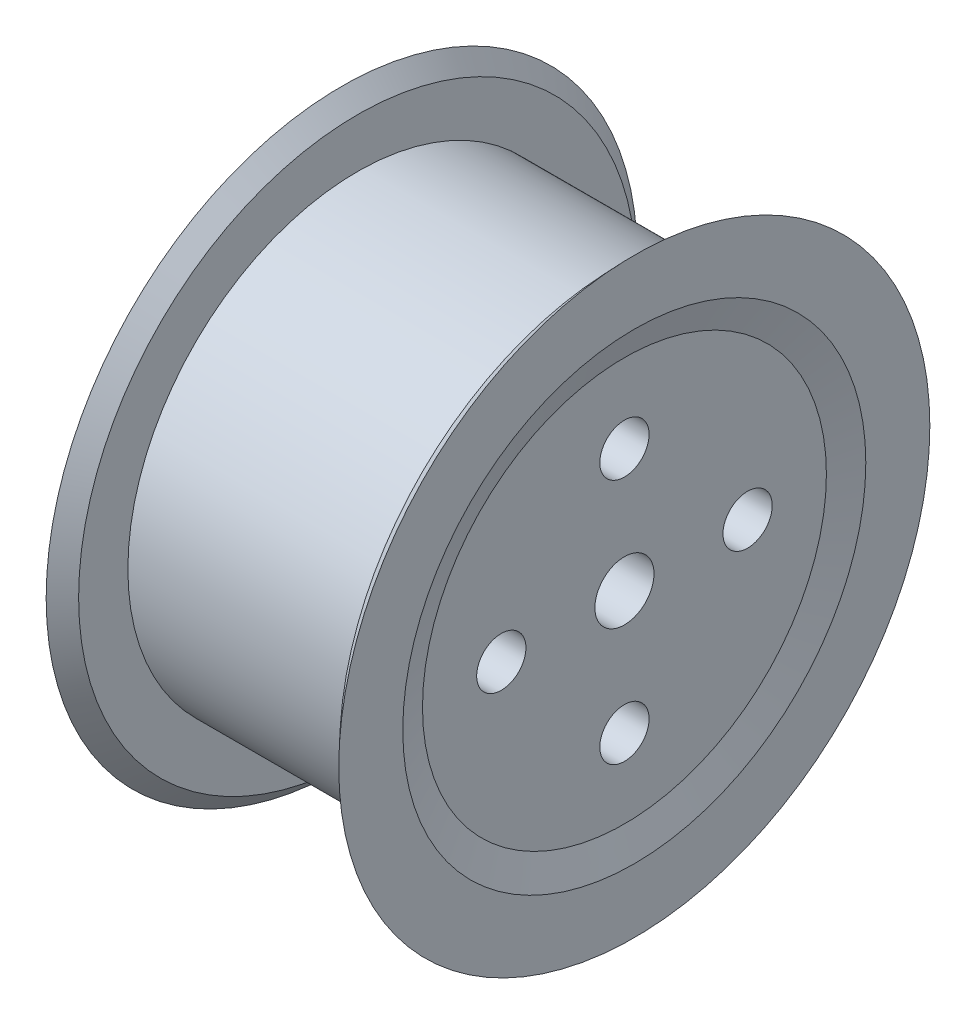
ISO-10303-21;
HEADER;
FILE_DESCRIPTION(('STEP AP214'),'2;1');
FILE_NAME('part.step','',(''),(''),'','','');
FILE_SCHEMA(('AUTOMOTIVE_DESIGN { 1 0 10303 214 1 1 1 1 }'));
ENDSEC;
DATA;
#1=APPLICATION_CONTEXT('core data for automotive mechanical design processes');
#2=APPLICATION_PROTOCOL_DEFINITION('international standard','automotive_design',2000,#1);
#3=PRODUCT_CONTEXT('',#1,'mechanical');
#4=PRODUCT('Part','Part','',(#3));
#5=PRODUCT_RELATED_PRODUCT_CATEGORY('part','',(#4));
#6=PRODUCT_DEFINITION_FORMATION('','',#4);
#7=PRODUCT_DEFINITION_CONTEXT('part definition',#1,'design');
#8=PRODUCT_DEFINITION('design','',#6,#7);
#9=PRODUCT_DEFINITION_SHAPE('','',#8);
#10=(LENGTH_UNIT() NAMED_UNIT(*) SI_UNIT(.MILLI.,.METRE.));
#11=(NAMED_UNIT(*) PLANE_ANGLE_UNIT() SI_UNIT($,.RADIAN.));
#12=(NAMED_UNIT(*) SI_UNIT($,.STERADIAN.) SOLID_ANGLE_UNIT());
#13=UNCERTAINTY_MEASURE_WITH_UNIT(LENGTH_MEASURE(1.E-05),#10,'distance_accuracy_value','');
#14=(GEOMETRIC_REPRESENTATION_CONTEXT(3) GLOBAL_UNCERTAINTY_ASSIGNED_CONTEXT((#13)) GLOBAL_UNIT_ASSIGNED_CONTEXT((#10,
#11,#12)) REPRESENTATION_CONTEXT('',''));
#15=CARTESIAN_POINT('',(0.,0.,0.));
#16=DIRECTION('',(0.,0.,1.));
#17=DIRECTION('',(1.,0.,0.));
#18=AXIS2_PLACEMENT_3D('',#15,#16,#17);
#19=CARTESIAN_POINT('',(1.,0.,0.));
#20=DIRECTION('',(1.,0.,0.));
#21=DIRECTION('',(0.,0.,-1.));
#22=AXIS2_PLACEMENT_3D('',#19,#20,#21);
#23=PLANE('',#22);
#24=CARTESIAN_POINT('',(1.,0.,0.));
#25=DIRECTION('',(-1.,0.,0.));
#26=DIRECTION('',(0.,0.,1.));
#27=AXIS2_PLACEMENT_3D('',#24,#25,#26);
#28=CIRCLE('',#27,17.45);
#29=CARTESIAN_POINT('',(1.,0.,17.45));
#30=VERTEX_POINT('',#29);
#31=EDGE_CURVE('E10',#30,#30,#28,.T.);
#32=ORIENTED_EDGE('',*,*,#31,.F.);
#33=EDGE_LOOP('',(#32));
#34=FACE_BOUND('',#33,.T.);
#35=CARTESIAN_POINT('',(1.,0.,0.));
#36=DIRECTION('',(-1.,0.,0.));
#37=DIRECTION('',(0.,0.,1.));
#38=AXIS2_PLACEMENT_3D('',#35,#36,#37);
#39=CIRCLE('',#38,20.5);
#40=CARTESIAN_POINT('',(1.,0.,20.5));
#41=VERTEX_POINT('',#40);
#42=EDGE_CURVE('E76',#41,#41,#39,.T.);
#43=ORIENTED_EDGE('',*,*,#42,.T.);
#44=EDGE_LOOP('',(#43));
#45=FACE_BOUND('',#44,.T.);
#46=ADVANCED_FACE('F41',(#34,#45),#23,.F.);
#47=CARTESIAN_POINT('',(0.,0.,0.));
#48=DIRECTION('',(-1.,0.,0.));
#49=DIRECTION('',(0.,0.,1.));
#50=AXIS2_PLACEMENT_3D('',#47,#48,#49);
#51=CYLINDRICAL_SURFACE('',#50,17.45);
#52=CARTESIAN_POINT('',(-7.79999999999999,0.,0.));
#53=DIRECTION('',(-1.,0.,0.));
#54=DIRECTION('',(0.,0.,1.));
#55=AXIS2_PLACEMENT_3D('',#52,#53,#54);
#56=CIRCLE('',#55,17.45);
#57=CARTESIAN_POINT('',(-7.79999999999999,0.,17.45));
#58=VERTEX_POINT('',#57);
#59=EDGE_CURVE('E49',#58,#58,#56,.T.);
#60=ORIENTED_EDGE('',*,*,#59,.F.);
#61=EDGE_LOOP('',(#60));
#62=FACE_BOUND('',#61,.T.);
#63=ORIENTED_EDGE('',*,*,#31,.T.);
#64=EDGE_LOOP('',(#63));
#65=FACE_BOUND('',#64,.T.);
#66=ADVANCED_FACE('F139',(#62,#65),#51,.T.);
#67=CARTESIAN_POINT('',(-7.8,0.,0.));
#68=DIRECTION('',(1.,0.,0.));
#69=DIRECTION('',(0.,0.,-1.));
#70=AXIS2_PLACEMENT_3D('',#67,#68,#69);
#71=PLANE('',#70);
#72=CARTESIAN_POINT('',(-7.79999999999999,0.,0.));
#73=DIRECTION('',(1.,0.,0.));
#74=DIRECTION('',(0.,0.,-1.));
#75=AXIS2_PLACEMENT_3D('',#72,#73,#74);
#76=CIRCLE('',#75,3.);
#77=CARTESIAN_POINT('',(-7.79999999999999,0.,-3.));
#78=VERTEX_POINT('',#77);
#79=EDGE_CURVE('E437',#78,#78,#76,.T.);
#80=ORIENTED_EDGE('',*,*,#79,.T.);
#81=EDGE_LOOP('',(#80));
#82=FACE_BOUND('',#81,.T.);
#83=CARTESIAN_POINT('',(-7.8,0.,-12.5));
#84=DIRECTION('',(-1.,0.,0.));
#85=DIRECTION('',(0.,0.,1.));
#86=AXIS2_PLACEMENT_3D('',#83,#84,#85);
#87=CIRCLE('',#86,3.025);
#88=CARTESIAN_POINT('',(-7.8,0.,-9.475));
#89=VERTEX_POINT('',#88);
#90=EDGE_CURVE('E444',#89,#89,#87,.T.);
#91=ORIENTED_EDGE('',*,*,#90,.F.);
#92=EDGE_LOOP('',(#91));
#93=FACE_BOUND('',#92,.T.);
#94=CARTESIAN_POINT('',(-7.8,12.5,0.));
#95=DIRECTION('',(-1.,0.,0.));
#96=DIRECTION('',(0.,0.,1.));
#97=AXIS2_PLACEMENT_3D('',#94,#95,#96);
#98=CIRCLE('',#97,3.025);
#99=CARTESIAN_POINT('',(-7.8,12.5,3.025));
#100=VERTEX_POINT('',#99);
#101=EDGE_CURVE('E454',#100,#100,#98,.T.);
#102=ORIENTED_EDGE('',*,*,#101,.F.);
#103=EDGE_LOOP('',(#102));
#104=FACE_BOUND('',#103,.T.);
#105=CARTESIAN_POINT('',(-7.8,0.,12.5));
#106=DIRECTION('',(-1.,0.,0.));
#107=DIRECTION('',(0.,0.,1.));
#108=AXIS2_PLACEMENT_3D('',#105,#106,#107);
#109=CIRCLE('',#108,3.025);
#110=CARTESIAN_POINT('',(-7.8,0.,15.525));
#111=VERTEX_POINT('',#110);
#112=EDGE_CURVE('E462',#111,#111,#109,.T.);
#113=ORIENTED_EDGE('',*,*,#112,.F.);
#114=EDGE_LOOP('',(#113));
#115=FACE_BOUND('',#114,.T.);
#116=CARTESIAN_POINT('',(-7.8,-12.5,0.));
#117=DIRECTION('',(-1.,0.,0.));
#118=DIRECTION('',(0.,0.,1.));
#119=AXIS2_PLACEMENT_3D('',#116,#117,#118);
#120=CIRCLE('',#119,3.025);
#121=CARTESIAN_POINT('',(-7.8,-12.5,3.025));
#122=VERTEX_POINT('',#121);
#123=EDGE_CURVE('E469',#122,#122,#120,.T.);
#124=ORIENTED_EDGE('',*,*,#123,.F.);
#125=EDGE_LOOP('',(#124));
#126=FACE_BOUND('',#125,.T.);
#127=ORIENTED_EDGE('',*,*,#59,.T.);
#128=EDGE_LOOP('',(#127));
#129=FACE_BOUND('',#128,.T.);
#130=ADVANCED_FACE('F130',(#82,#93,#104,#115,#126,#129),#71,.F.);
#131=CARTESIAN_POINT('',(28.7,0.,0.));
#132=DIRECTION('',(1.,0.,0.));
#133=DIRECTION('',(0.,0.,-1.));
#134=AXIS2_PLACEMENT_3D('',#131,#132,#133);
#135=PLANE('',#134);
#136=CARTESIAN_POINT('',(28.7,0.,0.));
#137=DIRECTION('',(1.,0.,0.));
#138=DIRECTION('',(0.,0.,-1.));
#139=AXIS2_PLACEMENT_3D('',#136,#137,#138);
#140=CIRCLE('',#139,3.);
#141=CARTESIAN_POINT('',(28.7,0.,-3.));
#142=VERTEX_POINT('',#141);
#143=EDGE_CURVE('E439',#142,#142,#140,.T.);
#144=ORIENTED_EDGE('',*,*,#143,.F.);
#145=EDGE_LOOP('',(#144));
#146=FACE_BOUND('',#145,.T.);
#147=CARTESIAN_POINT('',(28.7,0.,-12.5));
#148=DIRECTION('',(1.,0.,0.));
#149=DIRECTION('',(0.,0.,-1.));
#150=AXIS2_PLACEMENT_3D('',#147,#148,#149);
#151=CIRCLE('',#150,2.5);
#152=CARTESIAN_POINT('',(28.7,0.,-15.));
#153=VERTEX_POINT('',#152);
#154=EDGE_CURVE('E44',#153,#153,#151,.T.);
#155=ORIENTED_EDGE('',*,*,#154,.F.);
#156=EDGE_LOOP('',(#155));
#157=FACE_BOUND('',#156,.T.);
#158=CARTESIAN_POINT('',(28.7,-12.5,0.));
#159=DIRECTION('',(1.,0.,0.));
#160=DIRECTION('',(0.,0.,-1.));
#161=AXIS2_PLACEMENT_3D('',#158,#159,#160);
#162=CIRCLE('',#161,2.5);
#163=CARTESIAN_POINT('',(28.7,-12.5,-2.5));
#164=VERTEX_POINT('',#163);
#165=EDGE_CURVE('E68',#164,#164,#162,.T.);
#166=ORIENTED_EDGE('',*,*,#165,.F.);
#167=EDGE_LOOP('',(#166));
#168=FACE_BOUND('',#167,.T.);
#169=CARTESIAN_POINT('',(28.7,0.,12.5));
#170=DIRECTION('',(1.,0.,0.));
#171=DIRECTION('',(0.,0.,-1.));
#172=AXIS2_PLACEMENT_3D('',#169,#170,#171);
#173=CIRCLE('',#172,2.5);
#174=CARTESIAN_POINT('',(28.7,0.,10.));
#175=VERTEX_POINT('',#174);
#176=EDGE_CURVE('E64',#175,#175,#173,.T.);
#177=ORIENTED_EDGE('',*,*,#176,.F.);
#178=EDGE_LOOP('',(#177));
#179=FACE_BOUND('',#178,.T.);
#180=CARTESIAN_POINT('',(28.7,12.5,0.));
#181=DIRECTION('',(1.,0.,0.));
#182=DIRECTION('',(0.,0.,-1.));
#183=AXIS2_PLACEMENT_3D('',#180,#181,#182);
#184=CIRCLE('',#183,2.5);
#185=CARTESIAN_POINT('',(28.7,12.5,-2.5));
#186=VERTEX_POINT('',#185);
#187=EDGE_CURVE('E60',#186,#186,#184,.T.);
#188=ORIENTED_EDGE('',*,*,#187,.F.);
#189=EDGE_LOOP('',(#188));
#190=FACE_BOUND('',#189,.T.);
#191=CARTESIAN_POINT('',(28.7,0.,0.));
#192=DIRECTION('',(-1.,0.,0.));
#193=DIRECTION('',(0.,0.,1.));
#194=AXIS2_PLACEMENT_3D('',#191,#192,#193);
#195=CIRCLE('',#194,20.5);
#196=CARTESIAN_POINT('',(28.7,0.,20.5));
#197=VERTEX_POINT('',#196);
#198=EDGE_CURVE('E56',#197,#197,#195,.T.);
#199=ORIENTED_EDGE('',*,*,#198,.F.);
#200=EDGE_LOOP('',(#199));
#201=FACE_BOUND('',#200,.T.);
#202=ADVANCED_FACE('F128',(#146,#157,#168,#179,#190,#201),#135,.T.);
#203=CARTESIAN_POINT('',(29.7,0.,0.));
#204=DIRECTION('',(1.,0.,0.));
#205=DIRECTION('',(0.,0.,-1.));
#206=AXIS2_PLACEMENT_3D('',#203,#204,#205);
#207=CONICAL_SURFACE('',#206,23.5,1.24904577239825);
#208=ORIENTED_EDGE('',*,*,#198,.T.);
#209=EDGE_LOOP('',(#208));
#210=FACE_BOUND('',#209,.T.);
#211=CARTESIAN_POINT('',(29.7,0.,0.));
#212=DIRECTION('',(-1.,0.,0.));
#213=DIRECTION('',(0.,0.,1.));
#214=AXIS2_PLACEMENT_3D('',#211,#212,#213);
#215=CIRCLE('',#214,23.5);
#216=CARTESIAN_POINT('',(29.7,0.,23.5));
#217=VERTEX_POINT('',#216);
#218=EDGE_CURVE('E117',#217,#217,#215,.T.);
#219=ORIENTED_EDGE('',*,*,#218,.F.);
#220=EDGE_LOOP('',(#219));
#221=FACE_BOUND('',#220,.T.);
#222=ADVANCED_FACE('F125',(#210,#221),#207,.F.);
#223=CARTESIAN_POINT('',(29.7,0.,0.));
#224=DIRECTION('',(1.,0.,0.));
#225=DIRECTION('',(0.,0.,-1.));
#226=AXIS2_PLACEMENT_3D('',#223,#224,#225);
#227=PLANE('',#226);
#228=ORIENTED_EDGE('',*,*,#218,.T.);
#229=EDGE_LOOP('',(#228));
#230=FACE_BOUND('',#229,.T.);
#231=CARTESIAN_POINT('',(29.7,0.,0.));
#232=DIRECTION('',(-1.,0.,0.));
#233=DIRECTION('',(0.,0.,1.));
#234=AXIS2_PLACEMENT_3D('',#231,#232,#233);
#235=CIRCLE('',#234,30.);
#236=CARTESIAN_POINT('',(29.7,0.,30.));
#237=VERTEX_POINT('',#236);
#238=EDGE_CURVE('E113',#237,#237,#235,.T.);
#239=ORIENTED_EDGE('',*,*,#238,.F.);
#240=EDGE_LOOP('',(#239));
#241=FACE_BOUND('',#240,.T.);
#242=ADVANCED_FACE('F137',(#230,#241),#227,.T.);
#243=CARTESIAN_POINT('',(28.1,0.,0.));
#244=DIRECTION('',(1.,0.,0.));
#245=DIRECTION('',(0.,0.,-1.));
#246=AXIS2_PLACEMENT_3D('',#243,#244,#245);
#247=CONICAL_SURFACE('',#246,28.305,0.814221741521467);
#248=ORIENTED_EDGE('',*,*,#238,.T.);
#249=EDGE_LOOP('',(#248));
#250=FACE_BOUND('',#249,.T.);
#251=CARTESIAN_POINT('',(28.1,0.,0.));
#252=DIRECTION('',(-1.,0.,0.));
#253=DIRECTION('',(0.,0.,1.));
#254=AXIS2_PLACEMENT_3D('',#251,#252,#253);
#255=CIRCLE('',#254,28.305);
#256=CARTESIAN_POINT('',(28.1,0.,28.305));
#257=VERTEX_POINT('',#256);
#258=EDGE_CURVE('E109',#257,#257,#255,.T.);
#259=ORIENTED_EDGE('',*,*,#258,.F.);
#260=EDGE_LOOP('',(#259));
#261=FACE_BOUND('',#260,.T.);
#262=ADVANCED_FACE('F179',(#250,#261),#247,.T.);
#263=CARTESIAN_POINT('',(28.1,0.,0.));
#264=DIRECTION('',(-1.,0.,0.));
#265=DIRECTION('',(0.,0.,1.));
#266=AXIS2_PLACEMENT_3D('',#263,#264,#265);
#267=PLANE('',#266);
#268=ORIENTED_EDGE('',*,*,#258,.T.);
#269=EDGE_LOOP('',(#268));
#270=FACE_BOUND('',#269,.T.);
#271=CARTESIAN_POINT('',(28.1,0.,0.));
#272=DIRECTION('',(-1.,0.,0.));
#273=DIRECTION('',(0.,0.,1.));
#274=AXIS2_PLACEMENT_3D('',#271,#272,#273);
#275=CIRCLE('',#274,23.305);
#276=CARTESIAN_POINT('',(28.1,0.,23.305));
#277=VERTEX_POINT('',#276);
#278=EDGE_CURVE('E105',#277,#277,#275,.T.);
#279=ORIENTED_EDGE('',*,*,#278,.F.);
#280=EDGE_LOOP('',(#279));
#281=FACE_BOUND('',#280,.T.);
#282=ADVANCED_FACE('F189',(#270,#281),#267,.T.);
#283=CARTESIAN_POINT('',(0.,0.,0.));
#284=DIRECTION('',(-1.,0.,0.));
#285=DIRECTION('',(0.,0.,1.));
#286=AXIS2_PLACEMENT_3D('',#283,#284,#285);
#287=CYLINDRICAL_SURFACE('',#286,23.305);
#288=ORIENTED_EDGE('',*,*,#278,.T.);
#289=EDGE_LOOP('',(#288));
#290=FACE_BOUND('',#289,.T.);
#291=CARTESIAN_POINT('',(1.6,0.,0.));
#292=DIRECTION('',(-1.,0.,0.));
#293=DIRECTION('',(0.,0.,1.));
#294=AXIS2_PLACEMENT_3D('',#291,#292,#293);
#295=CIRCLE('',#294,23.305);
#296=CARTESIAN_POINT('',(1.6,0.,23.305));
#297=VERTEX_POINT('',#296);
#298=EDGE_CURVE('E101',#297,#297,#295,.T.);
#299=ORIENTED_EDGE('',*,*,#298,.F.);
#300=EDGE_LOOP('',(#299));
#301=FACE_BOUND('',#300,.T.);
#302=ADVANCED_FACE('F199',(#290,#301),#287,.T.);
#303=CARTESIAN_POINT('',(1.6,0.,0.));
#304=DIRECTION('',(1.,0.,0.));
#305=DIRECTION('',(0.,0.,-1.));
#306=AXIS2_PLACEMENT_3D('',#303,#304,#305);
#307=PLANE('',#306);
#308=ORIENTED_EDGE('',*,*,#298,.T.);
#309=EDGE_LOOP('',(#308));
#310=FACE_BOUND('',#309,.T.);
#311=CARTESIAN_POINT('',(1.6,0.,0.));
#312=DIRECTION('',(-1.,0.,0.));
#313=DIRECTION('',(0.,0.,1.));
#314=AXIS2_PLACEMENT_3D('',#311,#312,#313);
#315=CIRCLE('',#314,28.305);
#316=CARTESIAN_POINT('',(1.6,0.,28.305));
#317=VERTEX_POINT('',#316);
#318=EDGE_CURVE('E97',#317,#317,#315,.T.);
#319=ORIENTED_EDGE('',*,*,#318,.F.);
#320=EDGE_LOOP('',(#319));
#321=FACE_BOUND('',#320,.T.);
#322=ADVANCED_FACE('F209',(#310,#321),#307,.T.);
#323=CARTESIAN_POINT('',(0.,0.,0.));
#324=DIRECTION('',(-1.,0.,0.));
#325=DIRECTION('',(0.,0.,1.));
#326=AXIS2_PLACEMENT_3D('',#323,#324,#325);
#327=CONICAL_SURFACE('',#326,30.,0.814221741521466);
#328=ORIENTED_EDGE('',*,*,#318,.T.);
#329=EDGE_LOOP('',(#328));
#330=FACE_BOUND('',#329,.T.);
#331=CARTESIAN_POINT('',(0.,0.,0.));
#332=DIRECTION('',(-1.,0.,0.));
#333=DIRECTION('',(0.,0.,1.));
#334=AXIS2_PLACEMENT_3D('',#331,#332,#333);
#335=CIRCLE('',#334,30.);
#336=CARTESIAN_POINT('',(0.,0.,30.));
#337=VERTEX_POINT('',#336);
#338=EDGE_CURVE('E89',#337,#337,#335,.T.);
#339=ORIENTED_EDGE('',*,*,#338,.F.);
#340=EDGE_LOOP('',(#339));
#341=FACE_BOUND('',#340,.T.);
#342=ADVANCED_FACE('F219',(#330,#341),#327,.T.);
#343=CARTESIAN_POINT('',(0.,0.,0.));
#344=DIRECTION('',(-1.,0.,0.));
#345=DIRECTION('',(0.,0.,1.));
#346=AXIS2_PLACEMENT_3D('',#343,#344,#345);
#347=PLANE('',#346);
#348=ORIENTED_EDGE('',*,*,#338,.T.);
#349=EDGE_LOOP('',(#348));
#350=FACE_BOUND('',#349,.T.);
#351=CARTESIAN_POINT('',(0.,0.,0.));
#352=DIRECTION('',(-1.,0.,0.));
#353=DIRECTION('',(0.,0.,1.));
#354=AXIS2_PLACEMENT_3D('',#351,#352,#353);
#355=CIRCLE('',#354,23.5);
#356=CARTESIAN_POINT('',(0.,0.,23.5));
#357=VERTEX_POINT('',#356);
#358=EDGE_CURVE('E82',#357,#357,#355,.T.);
#359=ORIENTED_EDGE('',*,*,#358,.F.);
#360=EDGE_LOOP('',(#359));
#361=FACE_BOUND('',#360,.T.);
#362=ADVANCED_FACE('F229',(#350,#361),#347,.T.);
#363=CARTESIAN_POINT('',(0.,0.,0.));
#364=DIRECTION('',(-1.,0.,0.));
#365=DIRECTION('',(0.,0.,1.));
#366=AXIS2_PLACEMENT_3D('',#363,#364,#365);
#367=CONICAL_SURFACE('',#366,23.5,1.24904577239825);
#368=ORIENTED_EDGE('',*,*,#42,.F.);
#369=EDGE_LOOP('',(#368));
#370=FACE_BOUND('',#369,.T.);
#371=ORIENTED_EDGE('',*,*,#358,.T.);
#372=EDGE_LOOP('',(#371));
#373=FACE_BOUND('',#372,.T.);
#374=ADVANCED_FACE('F239',(#370,#373),#367,.F.);
#375=CARTESIAN_POINT('',(-7.79999999999999,12.5,0.));
#376=DIRECTION('',(1.,0.,0.));
#377=DIRECTION('',(0.,0.,-1.));
#378=AXIS2_PLACEMENT_3D('',#375,#376,#377);
#379=CYLINDRICAL_SURFACE('',#378,2.5);
#380=CARTESIAN_POINT('',(-7.275,12.5,0.));
#381=DIRECTION('',(-1.,0.,0.));
#382=DIRECTION('',(0.,0.,1.));
#383=AXIS2_PLACEMENT_3D('',#380,#381,#382);
#384=CIRCLE('',#383,2.49999999999999);
#385=CARTESIAN_POINT('',(-7.275,12.5,2.5));
#386=VERTEX_POINT('',#385);
#387=EDGE_CURVE('E458',#386,#386,#384,.T.);
#388=ORIENTED_EDGE('',*,*,#387,.T.);
#389=EDGE_LOOP('',(#388));
#390=FACE_BOUND('',#389,.T.);
#391=ORIENTED_EDGE('',*,*,#187,.T.);
#392=EDGE_LOOP('',(#391));
#393=FACE_BOUND('',#392,.T.);
#394=ADVANCED_FACE('F249',(#390,#393),#379,.F.);
#395=CARTESIAN_POINT('',(-7.79999999999999,0.,12.5));
#396=DIRECTION('',(1.,0.,0.));
#397=DIRECTION('',(0.,0.,-1.));
#398=AXIS2_PLACEMENT_3D('',#395,#396,#397);
#399=CYLINDRICAL_SURFACE('',#398,2.5);
#400=CARTESIAN_POINT('',(-7.275,0.,12.5));
#401=DIRECTION('',(-1.,0.,0.));
#402=DIRECTION('',(0.,0.,1.));
#403=AXIS2_PLACEMENT_3D('',#400,#401,#402);
#404=CIRCLE('',#403,2.49999999999999);
#405=CARTESIAN_POINT('',(-7.275,0.,15.));
#406=VERTEX_POINT('',#405);
#407=EDGE_CURVE('E466',#406,#406,#404,.T.);
#408=ORIENTED_EDGE('',*,*,#407,.T.);
#409=EDGE_LOOP('',(#408));
#410=FACE_BOUND('',#409,.T.);
#411=ORIENTED_EDGE('',*,*,#176,.T.);
#412=EDGE_LOOP('',(#411));
#413=FACE_BOUND('',#412,.T.);
#414=ADVANCED_FACE('F260',(#410,#413),#399,.F.);
#415=CARTESIAN_POINT('',(-7.79999999999999,-12.5,0.));
#416=DIRECTION('',(1.,0.,0.));
#417=DIRECTION('',(0.,0.,-1.));
#418=AXIS2_PLACEMENT_3D('',#415,#416,#417);
#419=CYLINDRICAL_SURFACE('',#418,2.5);
#420=CARTESIAN_POINT('',(-7.275,-12.5,0.));
#421=DIRECTION('',(-1.,0.,0.));
#422=DIRECTION('',(0.,0.,1.));
#423=AXIS2_PLACEMENT_3D('',#420,#421,#422);
#424=CIRCLE('',#423,2.49999999999999);
#425=CARTESIAN_POINT('',(-7.275,-12.5,2.49999999999999));
#426=VERTEX_POINT('',#425);
#427=EDGE_CURVE('E65',#426,#426,#424,.T.);
#428=ORIENTED_EDGE('',*,*,#427,.T.);
#429=EDGE_LOOP('',(#428));
#430=FACE_BOUND('',#429,.T.);
#431=ORIENTED_EDGE('',*,*,#165,.T.);
#432=EDGE_LOOP('',(#431));
#433=FACE_BOUND('',#432,.T.);
#434=ADVANCED_FACE('F270',(#430,#433),#419,.F.);
#435=CARTESIAN_POINT('',(-7.79999999999999,0.,-12.5));
#436=DIRECTION('',(1.,0.,0.));
#437=DIRECTION('',(0.,0.,-1.));
#438=AXIS2_PLACEMENT_3D('',#435,#436,#437);
#439=CYLINDRICAL_SURFACE('',#438,2.5);
#440=CARTESIAN_POINT('',(-7.275,0.,-12.5));
#441=DIRECTION('',(-1.,0.,0.));
#442=DIRECTION('',(0.,0.,1.));
#443=AXIS2_PLACEMENT_3D('',#440,#441,#442);
#444=CIRCLE('',#443,2.49999999999999);
#445=CARTESIAN_POINT('',(-7.275,0.,-10.));
#446=VERTEX_POINT('',#445);
#447=EDGE_CURVE('E450',#446,#446,#444,.T.);
#448=ORIENTED_EDGE('',*,*,#447,.T.);
#449=EDGE_LOOP('',(#448));
#450=FACE_BOUND('',#449,.T.);
#451=ORIENTED_EDGE('',*,*,#154,.T.);
#452=EDGE_LOOP('',(#451));
#453=FACE_BOUND('',#452,.T.);
#454=ADVANCED_FACE('F280',(#450,#453),#439,.F.);
#455=CARTESIAN_POINT('',(-7.8,-12.5,0.));
#456=DIRECTION('',(-1.,0.,0.));
#457=DIRECTION('',(0.,0.,1.));
#458=AXIS2_PLACEMENT_3D('',#455,#456,#457);
#459=CONICAL_SURFACE('',#458,3.025,0.785398163397455);
#460=ORIENTED_EDGE('',*,*,#427,.F.);
#461=EDGE_LOOP('',(#460));
#462=FACE_BOUND('',#461,.T.);
#463=ORIENTED_EDGE('',*,*,#123,.T.);
#464=EDGE_LOOP('',(#463));
#465=FACE_BOUND('',#464,.T.);
#466=ADVANCED_FACE('F290',(#462,#465),#459,.F.);
#467=CARTESIAN_POINT('',(-7.8,0.,12.5));
#468=DIRECTION('',(-1.,0.,0.));
#469=DIRECTION('',(0.,0.,1.));
#470=AXIS2_PLACEMENT_3D('',#467,#468,#469);
#471=CONICAL_SURFACE('',#470,3.025,0.785398163397455);
#472=ORIENTED_EDGE('',*,*,#407,.F.);
#473=EDGE_LOOP('',(#472));
#474=FACE_BOUND('',#473,.T.);
#475=ORIENTED_EDGE('',*,*,#112,.T.);
#476=EDGE_LOOP('',(#475));
#477=FACE_BOUND('',#476,.T.);
#478=ADVANCED_FACE('F301',(#474,#477),#471,.F.);
#479=CARTESIAN_POINT('',(-7.8,12.5,0.));
#480=DIRECTION('',(-1.,0.,0.));
#481=DIRECTION('',(0.,0.,1.));
#482=AXIS2_PLACEMENT_3D('',#479,#480,#481);
#483=CONICAL_SURFACE('',#482,3.025,0.785398163397455);
#484=ORIENTED_EDGE('',*,*,#387,.F.);
#485=EDGE_LOOP('',(#484));
#486=FACE_BOUND('',#485,.T.);
#487=ORIENTED_EDGE('',*,*,#101,.T.);
#488=EDGE_LOOP('',(#487));
#489=FACE_BOUND('',#488,.T.);
#490=ADVANCED_FACE('F311',(#486,#489),#483,.F.);
#491=CARTESIAN_POINT('',(-7.8,0.,-12.5));
#492=DIRECTION('',(-1.,0.,0.));
#493=DIRECTION('',(0.,0.,1.));
#494=AXIS2_PLACEMENT_3D('',#491,#492,#493);
#495=CONICAL_SURFACE('',#494,3.025,0.785398163397455);
#496=ORIENTED_EDGE('',*,*,#447,.F.);
#497=EDGE_LOOP('',(#496));
#498=FACE_BOUND('',#497,.T.);
#499=ORIENTED_EDGE('',*,*,#90,.T.);
#500=EDGE_LOOP('',(#499));
#501=FACE_BOUND('',#500,.T.);
#502=ADVANCED_FACE('F321',(#498,#501),#495,.F.);
#503=CARTESIAN_POINT('',(-7.79999999999999,0.,0.));
#504=DIRECTION('',(1.,0.,0.));
#505=DIRECTION('',(0.,0.,-1.));
#506=AXIS2_PLACEMENT_3D('',#503,#504,#505);
#507=CYLINDRICAL_SURFACE('',#506,3.);
#508=ORIENTED_EDGE('',*,*,#79,.F.);
#509=EDGE_LOOP('',(#508));
#510=FACE_BOUND('',#509,.T.);
#511=ORIENTED_EDGE('',*,*,#143,.T.);
#512=EDGE_LOOP('',(#511));
#513=FACE_BOUND('',#512,.T.);
#514=ADVANCED_FACE('F331',(#510,#513),#507,.F.);
#515=CLOSED_SHELL('',(#46,#66,#130,#202,#222,#242,#262,#282,#302,#322,#342,#362,#374,#394,#414,
#434,#454,#466,#478,#490,#502,#514));
#516=MANIFOLD_SOLID_BREP('B2',#515);
#517=ADVANCED_BREP_SHAPE_REPRESENTATION('',(#18,#516),#14);
#518=SHAPE_DEFINITION_REPRESENTATION(#9,#517);
ENDSEC;
END-ISO-10303-21;
